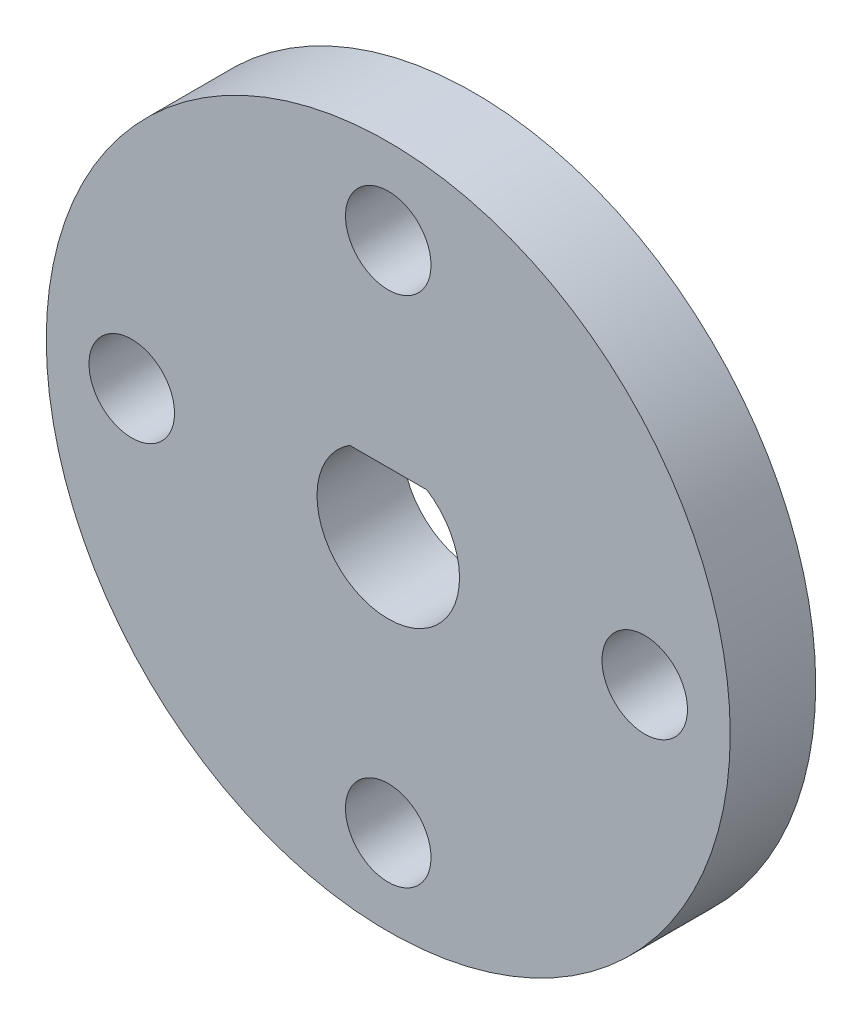
ISO-10303-21;
HEADER;
FILE_DESCRIPTION(('STEP AP214'),'2;1');
FILE_NAME('part.step','',(''),(''),'','','');
FILE_SCHEMA(('AUTOMOTIVE_DESIGN { 1 0 10303 214 1 1 1 1 }'));
ENDSEC;
DATA;
#1=APPLICATION_CONTEXT('core data for automotive mechanical design processes');
#2=APPLICATION_PROTOCOL_DEFINITION('international standard','automotive_design',2000,#1);
#3=PRODUCT_CONTEXT('',#1,'mechanical');
#4=PRODUCT('Part','Part','',(#3));
#5=PRODUCT_RELATED_PRODUCT_CATEGORY('part','',(#4));
#6=PRODUCT_DEFINITION_FORMATION('','',#4);
#7=PRODUCT_DEFINITION_CONTEXT('part definition',#1,'design');
#8=PRODUCT_DEFINITION('design','',#6,#7);
#9=PRODUCT_DEFINITION_SHAPE('','',#8);
#10=(LENGTH_UNIT() NAMED_UNIT(*) SI_UNIT(.MILLI.,.METRE.));
#11=(NAMED_UNIT(*) PLANE_ANGLE_UNIT() SI_UNIT($,.RADIAN.));
#12=(NAMED_UNIT(*) SI_UNIT($,.STERADIAN.) SOLID_ANGLE_UNIT());
#13=UNCERTAINTY_MEASURE_WITH_UNIT(LENGTH_MEASURE(1.E-05),#10,'distance_accuracy_value','');
#14=(GEOMETRIC_REPRESENTATION_CONTEXT(3) GLOBAL_UNCERTAINTY_ASSIGNED_CONTEXT((#13)) GLOBAL_UNIT_ASSIGNED_CONTEXT((#10,
#11,#12)) REPRESENTATION_CONTEXT('',''));
#15=CARTESIAN_POINT('',(0.,0.,0.));
#16=DIRECTION('',(0.,0.,1.));
#17=DIRECTION('',(1.,0.,0.));
#18=AXIS2_PLACEMENT_3D('',#15,#16,#17);
#19=CARTESIAN_POINT('',(0.,0.,3.));
#20=DIRECTION('',(0.,0.,1.));
#21=DIRECTION('',(1.,0.,0.));
#22=AXIS2_PLACEMENT_3D('',#19,#20,#21);
#23=PLANE('',#22);
#24=CARTESIAN_POINT('',(3.41144619695254E-13,-9.,3.));
#25=DIRECTION('',(0.,0.,1.));
#26=DIRECTION('',(1.,0.,0.));
#27=AXIS2_PLACEMENT_3D('',#24,#25,#26);
#28=CIRCLE('',#27,1.5);
#29=CARTESIAN_POINT('',(1.50000000000034,-9.,3.));
#30=VERTEX_POINT('',#29);
#31=EDGE_CURVE('E100',#30,#30,#28,.T.);
#32=ORIENTED_EDGE('',*,*,#31,.F.);
#33=EDGE_LOOP('',(#32));
#34=FACE_BOUND('',#33,.T.);
#35=CARTESIAN_POINT('',(0.,9.,3.));
#36=DIRECTION('',(0.,0.,1.));
#37=DIRECTION('',(1.,0.,0.));
#38=AXIS2_PLACEMENT_3D('',#35,#36,#37);
#39=CIRCLE('',#38,1.5);
#40=CARTESIAN_POINT('',(1.5,9.,3.));
#41=VERTEX_POINT('',#40);
#42=EDGE_CURVE('E84',#41,#41,#39,.T.);
#43=ORIENTED_EDGE('',*,*,#42,.F.);
#44=EDGE_LOOP('',(#43));
#45=FACE_BOUND('',#44,.T.);
#46=CARTESIAN_POINT('',(0.,0.,3.));
#47=DIRECTION('',(0.,0.,1.));
#48=DIRECTION('',(1.,0.,0.));
#49=AXIS2_PLACEMENT_3D('',#46,#47,#48);
#50=CIRCLE('',#49,12.);
#51=CARTESIAN_POINT('',(12.,0.,3.));
#52=VERTEX_POINT('',#51);
#53=EDGE_CURVE('E13',#52,#52,#50,.T.);
#54=ORIENTED_EDGE('',*,*,#53,.T.);
#55=EDGE_LOOP('',(#54));
#56=FACE_BOUND('',#55,.T.);
#57=DIRECTION('',(-1.,0.,0.));
#58=VECTOR('',#57,1.);
#59=CARTESIAN_POINT('',(1.35646599662505,2.1,3.));
#60=LINE('',#59,#58);
#61=CARTESIAN_POINT('',(1.35646599662505,2.1,3.));
#62=VERTEX_POINT('',#61);
#63=CARTESIAN_POINT('',(-1.35646599662505,2.1,3.));
#64=VERTEX_POINT('',#63);
#65=EDGE_CURVE('E90',#62,#64,#60,.T.);
#66=ORIENTED_EDGE('',*,*,#65,.F.);
#67=CARTESIAN_POINT('',(0.,0.,3.));
#68=DIRECTION('',(0.,0.,1.));
#69=DIRECTION('',(1.,0.,0.));
#70=AXIS2_PLACEMENT_3D('',#67,#68,#69);
#71=CIRCLE('',#70,2.5);
#72=EDGE_CURVE('E76',#64,#62,#71,.T.);
#73=ORIENTED_EDGE('',*,*,#72,.F.);
#74=EDGE_LOOP('',(#66,#73));
#75=FACE_BOUND('',#74,.T.);
#76=CARTESIAN_POINT('',(9.00000000000017,1.70388612827755E-13,3.));
#77=DIRECTION('',(0.,0.,1.));
#78=DIRECTION('',(1.,0.,0.));
#79=AXIS2_PLACEMENT_3D('',#76,#77,#78);
#80=CIRCLE('',#79,1.5);
#81=CARTESIAN_POINT('',(10.5000000000002,1.70388612827755E-13,3.));
#82=VERTEX_POINT('',#81);
#83=EDGE_CURVE('E95',#82,#82,#80,.T.);
#84=ORIENTED_EDGE('',*,*,#83,.F.);
#85=EDGE_LOOP('',(#84));
#86=FACE_BOUND('',#85,.T.);
#87=CARTESIAN_POINT('',(-8.99999999999983,-1.71490794946988E-13,3.));
#88=DIRECTION('',(0.,0.,1.));
#89=DIRECTION('',(1.,0.,0.));
#90=AXIS2_PLACEMENT_3D('',#87,#88,#89);
#91=CIRCLE('',#90,1.5);
#92=CARTESIAN_POINT('',(-7.49999999999983,-1.71490794946988E-13,3.));
#93=VERTEX_POINT('',#92);
#94=EDGE_CURVE('E106',#93,#93,#91,.T.);
#95=ORIENTED_EDGE('',*,*,#94,.F.);
#96=EDGE_LOOP('',(#95));
#97=FACE_BOUND('',#96,.T.);
#98=ADVANCED_FACE('F44',(#34,#45,#56,#75,#86,#97),#23,.T.);
#99=CARTESIAN_POINT('',(0.,0.,0.));
#100=DIRECTION('',(0.,0.,1.));
#101=DIRECTION('',(1.,0.,0.));
#102=AXIS2_PLACEMENT_3D('',#99,#100,#101);
#103=PLANE('',#102);
#104=CARTESIAN_POINT('',(0.,0.,0.));
#105=DIRECTION('',(0.,0.,1.));
#106=DIRECTION('',(1.,0.,0.));
#107=AXIS2_PLACEMENT_3D('',#104,#105,#106);
#108=CIRCLE('',#107,12.);
#109=CARTESIAN_POINT('',(12.,0.,0.));
#110=VERTEX_POINT('',#109);
#111=EDGE_CURVE('E48',#110,#110,#108,.T.);
#112=ORIENTED_EDGE('',*,*,#111,.F.);
#113=EDGE_LOOP('',(#112));
#114=FACE_BOUND('',#113,.T.);
#115=CARTESIAN_POINT('',(0.,0.,0.));
#116=DIRECTION('',(0.,0.,1.));
#117=DIRECTION('',(1.,0.,0.));
#118=AXIS2_PLACEMENT_3D('',#115,#116,#117);
#119=CIRCLE('',#118,2.5);
#120=CARTESIAN_POINT('',(-1.35646599662505,2.1,0.));
#121=VERTEX_POINT('',#120);
#122=CARTESIAN_POINT('',(1.35646599662505,2.1,0.));
#123=VERTEX_POINT('',#122);
#124=EDGE_CURVE('E66',#121,#123,#119,.T.);
#125=ORIENTED_EDGE('',*,*,#124,.T.);
#126=DIRECTION('',(-1.,0.,0.));
#127=VECTOR('',#126,1.);
#128=CARTESIAN_POINT('',(1.35646599662505,2.1,0.));
#129=LINE('',#128,#127);
#130=EDGE_CURVE('E72',#123,#121,#129,.T.);
#131=ORIENTED_EDGE('',*,*,#130,.T.);
#132=EDGE_LOOP('',(#125,#131));
#133=FACE_BOUND('',#132,.T.);
#134=CARTESIAN_POINT('',(0.,9.,0.));
#135=DIRECTION('',(0.,0.,1.));
#136=DIRECTION('',(1.,0.,0.));
#137=AXIS2_PLACEMENT_3D('',#134,#135,#136);
#138=CIRCLE('',#137,1.5);
#139=CARTESIAN_POINT('',(1.5,9.,0.));
#140=VERTEX_POINT('',#139);
#141=EDGE_CURVE('E87',#140,#140,#138,.T.);
#142=ORIENTED_EDGE('',*,*,#141,.T.);
#143=EDGE_LOOP('',(#142));
#144=FACE_BOUND('',#143,.T.);
#145=CARTESIAN_POINT('',(9.00000000000017,1.70388612827755E-13,0.));
#146=DIRECTION('',(0.,0.,1.));
#147=DIRECTION('',(1.,0.,0.));
#148=AXIS2_PLACEMENT_3D('',#145,#146,#147);
#149=CIRCLE('',#148,1.5);
#150=CARTESIAN_POINT('',(10.5000000000002,1.70388612827755E-13,0.));
#151=VERTEX_POINT('',#150);
#152=EDGE_CURVE('E97',#151,#151,#149,.T.);
#153=ORIENTED_EDGE('',*,*,#152,.T.);
#154=EDGE_LOOP('',(#153));
#155=FACE_BOUND('',#154,.T.);
#156=CARTESIAN_POINT('',(3.41144619695254E-13,-9.,0.));
#157=DIRECTION('',(0.,0.,1.));
#158=DIRECTION('',(1.,0.,0.));
#159=AXIS2_PLACEMENT_3D('',#156,#157,#158);
#160=CIRCLE('',#159,1.5);
#161=CARTESIAN_POINT('',(1.50000000000034,-9.,0.));
#162=VERTEX_POINT('',#161);
#163=EDGE_CURVE('E103',#162,#162,#160,.T.);
#164=ORIENTED_EDGE('',*,*,#163,.T.);
#165=EDGE_LOOP('',(#164));
#166=FACE_BOUND('',#165,.T.);
#167=CARTESIAN_POINT('',(-8.99999999999983,-1.71490794946988E-13,0.));
#168=DIRECTION('',(0.,0.,1.));
#169=DIRECTION('',(1.,0.,0.));
#170=AXIS2_PLACEMENT_3D('',#167,#168,#169);
#171=CIRCLE('',#170,1.5);
#172=CARTESIAN_POINT('',(-7.49999999999983,-1.71490794946988E-13,0.));
#173=VERTEX_POINT('',#172);
#174=EDGE_CURVE('E109',#173,#173,#171,.T.);
#175=ORIENTED_EDGE('',*,*,#174,.T.);
#176=EDGE_LOOP('',(#175));
#177=FACE_BOUND('',#176,.T.);
#178=ADVANCED_FACE('F82',(#114,#133,#144,#155,#166,#177),#103,.F.);
#179=CARTESIAN_POINT('',(0.,0.,3.));
#180=DIRECTION('',(0.,0.,-1.));
#181=DIRECTION('',(-1.,0.,0.));
#182=AXIS2_PLACEMENT_3D('',#179,#180,#181);
#183=CYLINDRICAL_SURFACE('',#182,12.);
#184=ORIENTED_EDGE('',*,*,#53,.F.);
#185=EDGE_LOOP('',(#184));
#186=FACE_BOUND('',#185,.T.);
#187=ORIENTED_EDGE('',*,*,#111,.T.);
#188=EDGE_LOOP('',(#187));
#189=FACE_BOUND('',#188,.T.);
#190=ADVANCED_FACE('F46',(#186,#189),#183,.T.);
#191=CARTESIAN_POINT('',(0.,0.,3.));
#192=DIRECTION('',(0.,0.,-1.));
#193=DIRECTION('',(-1.,0.,0.));
#194=AXIS2_PLACEMENT_3D('',#191,#192,#193);
#195=CYLINDRICAL_SURFACE('',#194,2.5);
#196=ORIENTED_EDGE('',*,*,#124,.F.);
#197=DIRECTION('',(0.,0.,-1.));
#198=VECTOR('',#197,1.);
#199=CARTESIAN_POINT('',(-1.35646599662505,2.1,3.));
#200=LINE('',#199,#198);
#201=EDGE_CURVE('E74',#64,#121,#200,.T.);
#202=ORIENTED_EDGE('',*,*,#201,.F.);
#203=ORIENTED_EDGE('',*,*,#72,.T.);
#204=DIRECTION('',(0.,0.,-1.));
#205=VECTOR('',#204,1.);
#206=CARTESIAN_POINT('',(1.35646599662505,2.1,3.));
#207=LINE('',#206,#205);
#208=EDGE_CURVE('E59',#62,#123,#207,.T.);
#209=ORIENTED_EDGE('',*,*,#208,.T.);
#210=EDGE_LOOP('',(#196,#202,#203,#209));
#211=FACE_BOUND('',#210,.T.);
#212=ADVANCED_FACE('F78',(#211),#195,.F.);
#213=CARTESIAN_POINT('',(1.35646599662505,2.1,3.));
#214=DIRECTION('',(0.,-1.,0.));
#215=DIRECTION('',(0.,0.,-1.));
#216=AXIS2_PLACEMENT_3D('',#213,#214,#215);
#217=PLANE('',#216);
#218=ORIENTED_EDGE('',*,*,#130,.F.);
#219=ORIENTED_EDGE('',*,*,#208,.F.);
#220=ORIENTED_EDGE('',*,*,#65,.T.);
#221=ORIENTED_EDGE('',*,*,#201,.T.);
#222=EDGE_LOOP('',(#218,#219,#220,#221));
#223=FACE_BOUND('',#222,.T.);
#224=ADVANCED_FACE('F73',(#223),#217,.T.);
#225=CARTESIAN_POINT('',(0.,9.,3.));
#226=DIRECTION('',(0.,0.,-1.));
#227=DIRECTION('',(-1.,0.,0.));
#228=AXIS2_PLACEMENT_3D('',#225,#226,#227);
#229=CYLINDRICAL_SURFACE('',#228,1.5);
#230=ORIENTED_EDGE('',*,*,#42,.T.);
#231=EDGE_LOOP('',(#230));
#232=FACE_BOUND('',#231,.T.);
#233=ORIENTED_EDGE('',*,*,#141,.F.);
#234=EDGE_LOOP('',(#233));
#235=FACE_BOUND('',#234,.T.);
#236=ADVANCED_FACE('F132',(#232,#235),#229,.F.);
#237=CARTESIAN_POINT('',(9.00000000000017,1.70388612827755E-13,3.));
#238=DIRECTION('',(0.,0.,-1.));
#239=DIRECTION('',(-1.,0.,0.));
#240=AXIS2_PLACEMENT_3D('',#237,#238,#239);
#241=CYLINDRICAL_SURFACE('',#240,1.5);
#242=ORIENTED_EDGE('',*,*,#83,.T.);
#243=EDGE_LOOP('',(#242));
#244=FACE_BOUND('',#243,.T.);
#245=ORIENTED_EDGE('',*,*,#152,.F.);
#246=EDGE_LOOP('',(#245));
#247=FACE_BOUND('',#246,.T.);
#248=ADVANCED_FACE('F135',(#244,#247),#241,.F.);
#249=CARTESIAN_POINT('',(3.41144619695254E-13,-9.,3.));
#250=DIRECTION('',(0.,0.,-1.));
#251=DIRECTION('',(-1.,0.,0.));
#252=AXIS2_PLACEMENT_3D('',#249,#250,#251);
#253=CYLINDRICAL_SURFACE('',#252,1.5);
#254=ORIENTED_EDGE('',*,*,#31,.T.);
#255=EDGE_LOOP('',(#254));
#256=FACE_BOUND('',#255,.T.);
#257=ORIENTED_EDGE('',*,*,#163,.F.);
#258=EDGE_LOOP('',(#257));
#259=FACE_BOUND('',#258,.T.);
#260=ADVANCED_FACE('F139',(#256,#259),#253,.F.);
#261=CARTESIAN_POINT('',(-8.99999999999983,-1.71490794946988E-13,3.));
#262=DIRECTION('',(0.,0.,-1.));
#263=DIRECTION('',(-1.,0.,0.));
#264=AXIS2_PLACEMENT_3D('',#261,#262,#263);
#265=CYLINDRICAL_SURFACE('',#264,1.5);
#266=ORIENTED_EDGE('',*,*,#94,.T.);
#267=EDGE_LOOP('',(#266));
#268=FACE_BOUND('',#267,.T.);
#269=ORIENTED_EDGE('',*,*,#174,.F.);
#270=EDGE_LOOP('',(#269));
#271=FACE_BOUND('',#270,.T.);
#272=ADVANCED_FACE('F115',(#268,#271),#265,.F.);
#273=CLOSED_SHELL('',(#98,#178,#190,#212,#224,#236,#248,#260,#272));
#274=MANIFOLD_SOLID_BREP('B2',#273);
#275=ADVANCED_BREP_SHAPE_REPRESENTATION('',(#18,#274),#14);
#276=SHAPE_DEFINITION_REPRESENTATION(#9,#275);
ENDSEC;
END-ISO-10303-21;
